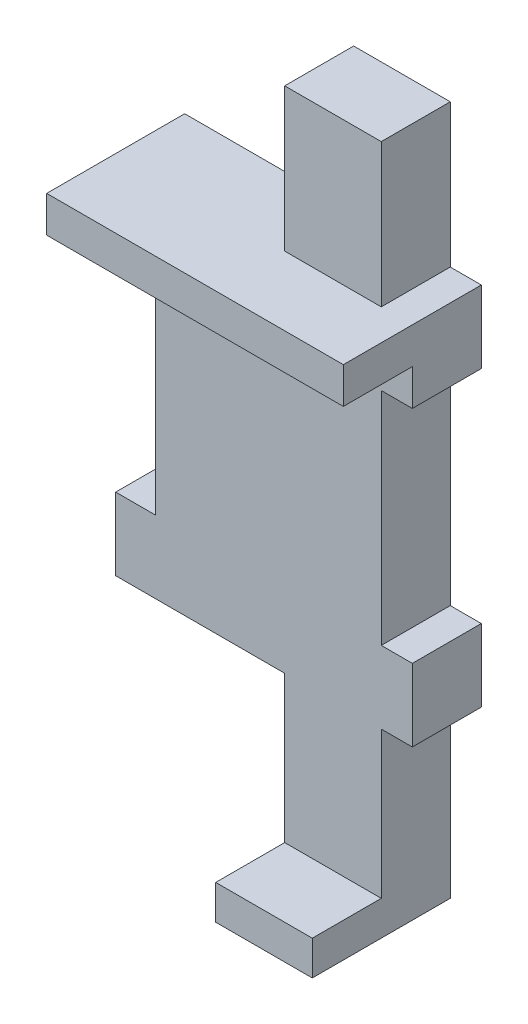
ISO-10303-21;
HEADER;
FILE_DESCRIPTION(('STEP AP214'),'2;1');
FILE_NAME('part.step','',(''),(''),'','','');
FILE_SCHEMA(('AUTOMOTIVE_DESIGN { 1 0 10303 214 1 1 1 1 }'));
ENDSEC;
DATA;
#1=APPLICATION_CONTEXT('core data for automotive mechanical design processes');
#2=APPLICATION_PROTOCOL_DEFINITION('international standard','automotive_design',2000,#1);
#3=PRODUCT_CONTEXT('',#1,'mechanical');
#4=PRODUCT('Part','Part','',(#3));
#5=PRODUCT_RELATED_PRODUCT_CATEGORY('part','',(#4));
#6=PRODUCT_DEFINITION_FORMATION('','',#4);
#7=PRODUCT_DEFINITION_CONTEXT('part definition',#1,'design');
#8=PRODUCT_DEFINITION('design','',#6,#7);
#9=PRODUCT_DEFINITION_SHAPE('','',#8);
#10=(LENGTH_UNIT() NAMED_UNIT(*) SI_UNIT(.MILLI.,.METRE.));
#11=(NAMED_UNIT(*) PLANE_ANGLE_UNIT() SI_UNIT($,.RADIAN.));
#12=(NAMED_UNIT(*) SI_UNIT($,.STERADIAN.) SOLID_ANGLE_UNIT());
#13=UNCERTAINTY_MEASURE_WITH_UNIT(LENGTH_MEASURE(1.E-05),#10,'distance_accuracy_value','');
#14=(GEOMETRIC_REPRESENTATION_CONTEXT(3) GLOBAL_UNCERTAINTY_ASSIGNED_CONTEXT((#13)) GLOBAL_UNIT_ASSIGNED_CONTEXT((#10,
#11,#12)) REPRESENTATION_CONTEXT('',''));
#15=CARTESIAN_POINT('',(0.,0.,0.));
#16=DIRECTION('',(0.,0.,1.));
#17=DIRECTION('',(1.,0.,0.));
#18=AXIS2_PLACEMENT_3D('',#15,#16,#17);
#19=CARTESIAN_POINT('',(0.,0.,4.));
#20=DIRECTION('',(0.,0.,1.));
#21=DIRECTION('',(1.,0.,0.));
#22=AXIS2_PLACEMENT_3D('',#19,#20,#21);
#23=PLANE('',#22);
#24=DIRECTION('',(0.,1.,0.));
#25=VECTOR('',#24,1.);
#26=CARTESIAN_POINT('',(4.6,11.7,4.));
#27=LINE('',#26,#25);
#28=CARTESIAN_POINT('',(4.6,7.5,4.));
#29=VERTEX_POINT('',#28);
#30=CARTESIAN_POINT('',(4.6,9.6,4.));
#31=VERTEX_POINT('',#30);
#32=EDGE_CURVE('E352',#29,#31,#27,.T.);
#33=ORIENTED_EDGE('',*,*,#32,.T.);
#34=DIRECTION('',(1.,0.,0.));
#35=VECTOR('',#34,1.);
#36=CARTESIAN_POINT('',(-12.6,9.6,4.));
#37=LINE('',#36,#35);
#38=CARTESIAN_POINT('',(-12.6,9.6,4.));
#39=VERTEX_POINT('',#38);
#40=EDGE_CURVE('E234',#39,#31,#37,.T.);
#41=ORIENTED_EDGE('',*,*,#40,.F.);
#42=DIRECTION('',(0.,1.,0.));
#43=VECTOR('',#42,1.);
#44=CARTESIAN_POINT('',(-12.6,11.7,4.));
#45=LINE('',#44,#43);
#46=CARTESIAN_POINT('',(-12.6,7.5,4.));
#47=VERTEX_POINT('',#46);
#48=EDGE_CURVE('E274',#47,#39,#45,.T.);
#49=ORIENTED_EDGE('',*,*,#48,.F.);
#50=DIRECTION('',(1.,0.,0.));
#51=VECTOR('',#50,1.);
#52=CARTESIAN_POINT('',(-4.6,7.5,4.));
#53=LINE('',#52,#51);
#54=CARTESIAN_POINT('',(-10.3,7.5,4.));
#55=VERTEX_POINT('',#54);
#56=EDGE_CURVE('E230',#47,#55,#53,.T.);
#57=ORIENTED_EDGE('',*,*,#56,.T.);
#58=DIRECTION('',(0.,1.,0.));
#59=VECTOR('',#58,1.);
#60=CARTESIAN_POINT('',(-10.3,7.5,4.));
#61=LINE('',#60,#59);
#62=CARTESIAN_POINT('',(-10.3,-5.3,4.));
#63=VERTEX_POINT('',#62);
#64=EDGE_CURVE('E223',#63,#55,#61,.T.);
#65=ORIENTED_EDGE('',*,*,#64,.F.);
#66=DIRECTION('',(1.,0.,0.));
#67=VECTOR('',#66,1.);
#68=CARTESIAN_POINT('',(-4.6,-5.3,4.));
#69=LINE('',#68,#67);
#70=CARTESIAN_POINT('',(-12.6,-5.3,4.));
#71=VERTEX_POINT('',#70);
#72=EDGE_CURVE('E204',#71,#63,#69,.T.);
#73=ORIENTED_EDGE('',*,*,#72,.F.);
#74=DIRECTION('',(0.,1.,0.));
#75=VECTOR('',#74,1.);
#76=CARTESIAN_POINT('',(-12.6,-5.3,4.));
#77=LINE('',#76,#75);
#78=CARTESIAN_POINT('',(-12.6,-9.5,4.));
#79=VERTEX_POINT('',#78);
#80=EDGE_CURVE('E285',#79,#71,#77,.T.);
#81=ORIENTED_EDGE('',*,*,#80,.F.);
#82=DIRECTION('',(1.,0.,0.));
#83=VECTOR('',#82,1.);
#84=CARTESIAN_POINT('',(-4.6,-9.5,4.));
#85=LINE('',#84,#83);
#86=CARTESIAN_POINT('',(-2.8,-9.5,4.));
#87=VERTEX_POINT('',#86);
#88=EDGE_CURVE('E216',#79,#87,#85,.T.);
#89=ORIENTED_EDGE('',*,*,#88,.T.);
#90=DIRECTION('',(0.,1.,0.));
#91=VECTOR('',#90,1.);
#92=CARTESIAN_POINT('',(-2.8,-20.,4.));
#93=LINE('',#92,#91);
#94=CARTESIAN_POINT('',(-2.8,-18.,4.));
#95=VERTEX_POINT('',#94);
#96=EDGE_CURVE('E426',#95,#87,#93,.T.);
#97=ORIENTED_EDGE('',*,*,#96,.F.);
#98=DIRECTION('',(-1.,0.,0.));
#99=VECTOR('',#98,1.);
#100=CARTESIAN_POINT('',(-2.8,-18.,4.));
#101=LINE('',#100,#99);
#102=CARTESIAN_POINT('',(2.8,-18.,4.));
#103=VERTEX_POINT('',#102);
#104=EDGE_CURVE('E388',#103,#95,#101,.T.);
#105=ORIENTED_EDGE('',*,*,#104,.F.);
#106=DIRECTION('',(0.,1.,0.));
#107=VECTOR('',#106,1.);
#108=CARTESIAN_POINT('',(2.8,-20.,4.));
#109=LINE('',#108,#107);
#110=CARTESIAN_POINT('',(2.8,-9.5,4.));
#111=VERTEX_POINT('',#110);
#112=EDGE_CURVE('E415',#103,#111,#109,.T.);
#113=ORIENTED_EDGE('',*,*,#112,.T.);
#114=DIRECTION('',(-1.,0.,0.));
#115=VECTOR('',#114,1.);
#116=CARTESIAN_POINT('',(4.6,-9.5,4.));
#117=LINE('',#116,#115);
#118=CARTESIAN_POINT('',(4.6,-9.5,4.));
#119=VERTEX_POINT('',#118);
#120=EDGE_CURVE('E319',#119,#111,#117,.T.);
#121=ORIENTED_EDGE('',*,*,#120,.F.);
#122=DIRECTION('',(0.,-1.,0.));
#123=VECTOR('',#122,1.);
#124=CARTESIAN_POINT('',(4.6,-9.5,4.));
#125=LINE('',#124,#123);
#126=CARTESIAN_POINT('',(4.6,-5.3,4.));
#127=VERTEX_POINT('',#126);
#128=EDGE_CURVE('E303',#127,#119,#125,.T.);
#129=ORIENTED_EDGE('',*,*,#128,.F.);
#130=DIRECTION('',(-1.,0.,0.));
#131=VECTOR('',#130,1.);
#132=CARTESIAN_POINT('',(4.6,-5.3,4.));
#133=LINE('',#132,#131);
#134=CARTESIAN_POINT('',(2.8,-5.3,4.));
#135=VERTEX_POINT('',#134);
#136=EDGE_CURVE('E323',#127,#135,#133,.T.);
#137=ORIENTED_EDGE('',*,*,#136,.T.);
#138=CARTESIAN_POINT('',(2.8,7.5,4.));
#139=VERTEX_POINT('',#138);
#140=EDGE_CURVE('E420',#135,#139,#109,.T.);
#141=ORIENTED_EDGE('',*,*,#140,.T.);
#142=DIRECTION('',(-1.,0.,0.));
#143=VECTOR('',#142,1.);
#144=CARTESIAN_POINT('',(4.6,7.5,4.));
#145=LINE('',#144,#143);
#146=EDGE_CURVE('E369',#29,#139,#145,.T.);
#147=ORIENTED_EDGE('',*,*,#146,.F.);
#148=EDGE_LOOP('',(#33,#41,#49,#57,#65,#73,#81,#89,#97,#105,#113,#121,#129,#137,#141,#147));
#149=FACE_BOUND('',#148,.T.);
#150=ADVANCED_FACE('F45',(#149),#23,.T.);
#151=CARTESIAN_POINT('',(-2.8,11.7,4.));
#152=VERTEX_POINT('',#151);
#153=CARTESIAN_POINT('',(-2.8,20.,4.));
#154=VERTEX_POINT('',#153);
#155=EDGE_CURVE('E425',#152,#154,#93,.T.);
#156=ORIENTED_EDGE('',*,*,#155,.F.);
#157=DIRECTION('',(-1.,0.,0.));
#158=VECTOR('',#157,1.);
#159=CARTESIAN_POINT('',(-12.6,11.7,4.));
#160=LINE('',#159,#158);
#161=CARTESIAN_POINT('',(2.8,11.7,4.));
#162=VERTEX_POINT('',#161);
#163=EDGE_CURVE('E243',#162,#152,#160,.T.);
#164=ORIENTED_EDGE('',*,*,#163,.F.);
#165=CARTESIAN_POINT('',(2.8,20.,4.));
#166=VERTEX_POINT('',#165);
#167=EDGE_CURVE('E421',#162,#166,#109,.T.);
#168=ORIENTED_EDGE('',*,*,#167,.T.);
#169=DIRECTION('',(1.,0.,0.));
#170=VECTOR('',#169,1.);
#171=CARTESIAN_POINT('',(-2.8,20.,4.));
#172=LINE('',#171,#170);
#173=EDGE_CURVE('E419',#154,#166,#172,.T.);
#174=ORIENTED_EDGE('',*,*,#173,.F.);
#175=EDGE_LOOP('',(#156,#164,#168,#174));
#176=FACE_BOUND('',#175,.T.);
#177=ADVANCED_FACE('F474',(#176),#23,.T.);
#178=CARTESIAN_POINT('',(2.8,-20.,4.));
#179=DIRECTION('',(-1.,0.,0.));
#180=DIRECTION('',(0.,0.,1.));
#181=AXIS2_PLACEMENT_3D('',#178,#179,#180);
#182=PLANE('',#181);
#183=DIRECTION('',(0.,0.,1.));
#184=VECTOR('',#183,1.);
#185=CARTESIAN_POINT('',(2.8,-5.3,0.));
#186=LINE('',#185,#184);
#187=CARTESIAN_POINT('',(2.8,-5.3,0.));
#188=VERTEX_POINT('',#187);
#189=EDGE_CURVE('E282',#188,#135,#186,.T.);
#190=ORIENTED_EDGE('',*,*,#189,.F.);
#191=DIRECTION('',(0.,1.,0.));
#192=VECTOR('',#191,1.);
#193=CARTESIAN_POINT('',(2.8,-20.,0.));
#194=LINE('',#193,#192);
#195=CARTESIAN_POINT('',(2.8,7.5,0.));
#196=VERTEX_POINT('',#195);
#197=EDGE_CURVE('E439',#188,#196,#194,.T.);
#198=ORIENTED_EDGE('',*,*,#197,.T.);
#199=DIRECTION('',(0.,0.,1.));
#200=VECTOR('',#199,1.);
#201=CARTESIAN_POINT('',(2.8,7.5,0.));
#202=LINE('',#201,#200);
#203=EDGE_CURVE('E348',#196,#139,#202,.T.);
#204=ORIENTED_EDGE('',*,*,#203,.T.);
#205=ORIENTED_EDGE('',*,*,#140,.F.);
#206=EDGE_LOOP('',(#190,#198,#204,#205));
#207=FACE_BOUND('',#206,.T.);
#208=ADVANCED_FACE('F487',(#207),#182,.F.);
#209=DIRECTION('',(0.,0.,-1.));
#210=VECTOR('',#209,1.);
#211=CARTESIAN_POINT('',(2.8,-9.5,0.));
#212=LINE('',#211,#210);
#213=CARTESIAN_POINT('',(2.8,-9.5,0.));
#214=VERTEX_POINT('',#213);
#215=EDGE_CURVE('E300',#111,#214,#212,.T.);
#216=ORIENTED_EDGE('',*,*,#215,.F.);
#217=ORIENTED_EDGE('',*,*,#112,.F.);
#218=DIRECTION('',(0.,0.,-1.));
#219=VECTOR('',#218,1.);
#220=CARTESIAN_POINT('',(2.8,-18.,8.));
#221=LINE('',#220,#219);
#222=CARTESIAN_POINT('',(2.8,-18.,8.));
#223=VERTEX_POINT('',#222);
#224=EDGE_CURVE('E410',#223,#103,#221,.T.);
#225=ORIENTED_EDGE('',*,*,#224,.F.);
#226=DIRECTION('',(0.,1.,0.));
#227=VECTOR('',#226,1.);
#228=CARTESIAN_POINT('',(2.8,-20.,8.));
#229=LINE('',#228,#227);
#230=CARTESIAN_POINT('',(2.8,-20.,8.));
#231=VERTEX_POINT('',#230);
#232=EDGE_CURVE('E397',#231,#223,#229,.T.);
#233=ORIENTED_EDGE('',*,*,#232,.F.);
#234=DIRECTION('',(0.,0.,-1.));
#235=VECTOR('',#234,1.);
#236=CARTESIAN_POINT('',(2.8,-20.,4.));
#237=LINE('',#236,#235);
#238=CARTESIAN_POINT('',(2.8,-20.,0.));
#239=VERTEX_POINT('',#238);
#240=EDGE_CURVE('E11',#231,#239,#237,.T.);
#241=ORIENTED_EDGE('',*,*,#240,.T.);
#242=EDGE_CURVE('E435',#239,#214,#194,.T.);
#243=ORIENTED_EDGE('',*,*,#242,.T.);
#244=EDGE_LOOP('',(#216,#217,#225,#233,#241,#243));
#245=FACE_BOUND('',#244,.T.);
#246=ADVANCED_FACE('F530',(#245),#182,.F.);
#247=CARTESIAN_POINT('',(-2.8,-20.,4.));
#248=DIRECTION('',(-1.,0.,0.));
#249=DIRECTION('',(0.,0.,1.));
#250=AXIS2_PLACEMENT_3D('',#247,#248,#249);
#251=PLANE('',#250);
#252=DIRECTION('',(0.,0.,-1.));
#253=VECTOR('',#252,1.);
#254=CARTESIAN_POINT('',(-2.8,-9.5,0.));
#255=LINE('',#254,#253);
#256=CARTESIAN_POINT('',(-2.8,-9.5,0.));
#257=VERTEX_POINT('',#256);
#258=EDGE_CURVE('E331',#87,#257,#255,.T.);
#259=ORIENTED_EDGE('',*,*,#258,.T.);
#260=DIRECTION('',(0.,1.,0.));
#261=VECTOR('',#260,1.);
#262=CARTESIAN_POINT('',(-2.8,-20.,0.));
#263=LINE('',#262,#261);
#264=CARTESIAN_POINT('',(-2.8,-20.,0.));
#265=VERTEX_POINT('',#264);
#266=EDGE_CURVE('E444',#265,#257,#263,.T.);
#267=ORIENTED_EDGE('',*,*,#266,.F.);
#268=DIRECTION('',(0.,0.,-1.));
#269=VECTOR('',#268,1.);
#270=CARTESIAN_POINT('',(-2.8,-20.,4.));
#271=LINE('',#270,#269);
#272=CARTESIAN_POINT('',(-2.8,-20.,8.));
#273=VERTEX_POINT('',#272);
#274=EDGE_CURVE('E430',#273,#265,#271,.T.);
#275=ORIENTED_EDGE('',*,*,#274,.F.);
#276=DIRECTION('',(0.,-1.,0.));
#277=VECTOR('',#276,1.);
#278=CARTESIAN_POINT('',(-2.8,-20.,8.));
#279=LINE('',#278,#277);
#280=CARTESIAN_POINT('',(-2.8,-18.,8.));
#281=VERTEX_POINT('',#280);
#282=EDGE_CURVE('E389',#281,#273,#279,.T.);
#283=ORIENTED_EDGE('',*,*,#282,.F.);
#284=DIRECTION('',(0.,0.,-1.));
#285=VECTOR('',#284,1.);
#286=CARTESIAN_POINT('',(-2.8,-18.,8.));
#287=LINE('',#286,#285);
#288=EDGE_CURVE('E403',#281,#95,#287,.T.);
#289=ORIENTED_EDGE('',*,*,#288,.T.);
#290=ORIENTED_EDGE('',*,*,#96,.T.);
#291=EDGE_LOOP('',(#259,#267,#275,#283,#289,#290));
#292=FACE_BOUND('',#291,.T.);
#293=ADVANCED_FACE('F527',(#292),#251,.T.);
#294=DIRECTION('',(0.,0.,-1.));
#295=VECTOR('',#294,1.);
#296=CARTESIAN_POINT('',(-2.8,11.7,0.));
#297=LINE('',#296,#295);
#298=CARTESIAN_POINT('',(-2.8,11.7,0.));
#299=VERTEX_POINT('',#298);
#300=EDGE_CURVE('E376',#152,#299,#297,.T.);
#301=ORIENTED_EDGE('',*,*,#300,.F.);
#302=ORIENTED_EDGE('',*,*,#155,.T.);
#303=DIRECTION('',(0.,0.,-1.));
#304=VECTOR('',#303,1.);
#305=CARTESIAN_POINT('',(-2.8,20.,4.));
#306=LINE('',#305,#304);
#307=CARTESIAN_POINT('',(-2.8,20.,0.));
#308=VERTEX_POINT('',#307);
#309=EDGE_CURVE('E450',#154,#308,#306,.T.);
#310=ORIENTED_EDGE('',*,*,#309,.T.);
#311=EDGE_CURVE('E443',#299,#308,#263,.T.);
#312=ORIENTED_EDGE('',*,*,#311,.F.);
#313=EDGE_LOOP('',(#301,#302,#310,#312));
#314=FACE_BOUND('',#313,.T.);
#315=ADVANCED_FACE('F471',(#314),#251,.T.);
#316=CARTESIAN_POINT('',(-2.8,-20.,4.));
#317=DIRECTION('',(0.,1.,0.));
#318=DIRECTION('',(0.,0.,1.));
#319=AXIS2_PLACEMENT_3D('',#316,#317,#318);
#320=PLANE('',#319);
#321=DIRECTION('',(1.,0.,0.));
#322=VECTOR('',#321,1.);
#323=CARTESIAN_POINT('',(-2.8,-20.,0.));
#324=LINE('',#323,#322);
#325=EDGE_CURVE('E414',#265,#239,#324,.T.);
#326=ORIENTED_EDGE('',*,*,#325,.T.);
#327=ORIENTED_EDGE('',*,*,#240,.F.);
#328=DIRECTION('',(1.,0.,0.));
#329=VECTOR('',#328,1.);
#330=CARTESIAN_POINT('',(-2.8,-20.,8.));
#331=LINE('',#330,#329);
#332=EDGE_CURVE('E393',#273,#231,#331,.T.);
#333=ORIENTED_EDGE('',*,*,#332,.F.);
#334=ORIENTED_EDGE('',*,*,#274,.T.);
#335=EDGE_LOOP('',(#326,#327,#333,#334));
#336=FACE_BOUND('',#335,.T.);
#337=ADVANCED_FACE('F47',(#336),#320,.F.);
#338=ORIENTED_EDGE('',*,*,#167,.F.);
#339=DIRECTION('',(0.,0.,-1.));
#340=VECTOR('',#339,1.);
#341=CARTESIAN_POINT('',(2.8,11.7,0.));
#342=LINE('',#341,#340);
#343=CARTESIAN_POINT('',(2.8,11.7,0.));
#344=VERTEX_POINT('',#343);
#345=EDGE_CURVE('E342',#162,#344,#342,.T.);
#346=ORIENTED_EDGE('',*,*,#345,.T.);
#347=CARTESIAN_POINT('',(2.8,20.,0.));
#348=VERTEX_POINT('',#347);
#349=EDGE_CURVE('E434',#344,#348,#194,.T.);
#350=ORIENTED_EDGE('',*,*,#349,.T.);
#351=DIRECTION('',(0.,0.,-1.));
#352=VECTOR('',#351,1.);
#353=CARTESIAN_POINT('',(2.8,20.,4.));
#354=LINE('',#353,#352);
#355=EDGE_CURVE('E54',#166,#348,#354,.T.);
#356=ORIENTED_EDGE('',*,*,#355,.F.);
#357=EDGE_LOOP('',(#338,#346,#350,#356));
#358=FACE_BOUND('',#357,.T.);
#359=ADVANCED_FACE('F533',(#358),#182,.F.);
#360=CARTESIAN_POINT('',(-2.8,20.,4.));
#361=DIRECTION('',(0.,1.,0.));
#362=DIRECTION('',(0.,0.,1.));
#363=AXIS2_PLACEMENT_3D('',#360,#361,#362);
#364=PLANE('',#363);
#365=DIRECTION('',(1.,0.,0.));
#366=VECTOR('',#365,1.);
#367=CARTESIAN_POINT('',(-2.8,20.,0.));
#368=LINE('',#367,#366);
#369=EDGE_CURVE('E438',#308,#348,#368,.T.);
#370=ORIENTED_EDGE('',*,*,#369,.F.);
#371=ORIENTED_EDGE('',*,*,#309,.F.);
#372=ORIENTED_EDGE('',*,*,#173,.T.);
#373=ORIENTED_EDGE('',*,*,#355,.T.);
#374=EDGE_LOOP('',(#370,#371,#372,#373));
#375=FACE_BOUND('',#374,.T.);
#376=ADVANCED_FACE('F458',(#375),#364,.T.);
#377=CARTESIAN_POINT('',(0.,0.,0.));
#378=DIRECTION('',(0.,0.,1.));
#379=DIRECTION('',(1.,0.,0.));
#380=AXIS2_PLACEMENT_3D('',#377,#378,#379);
#381=PLANE('',#380);
#382=CARTESIAN_POINT('',(-4.9,1.1,0.));
#383=DIRECTION('',(0.,0.,-1.));
#384=DIRECTION('',(-1.,0.,0.));
#385=AXIS2_PLACEMENT_3D('',#382,#383,#384);
#386=CIRCLE('',#385,1.5);
#387=CARTESIAN_POINT('',(-6.4,1.1,0.));
#388=VERTEX_POINT('',#387);
#389=EDGE_CURVE('E838',#388,#388,#386,.T.);
#390=ORIENTED_EDGE('',*,*,#389,.F.);
#391=EDGE_LOOP('',(#390));
#392=FACE_BOUND('',#391,.T.);
#393=ORIENTED_EDGE('',*,*,#325,.F.);
#394=ORIENTED_EDGE('',*,*,#266,.T.);
#395=DIRECTION('',(1.,0.,0.));
#396=VECTOR('',#395,1.);
#397=CARTESIAN_POINT('',(-4.6,-9.5,0.));
#398=LINE('',#397,#396);
#399=CARTESIAN_POINT('',(-12.6,-9.5,0.));
#400=VERTEX_POINT('',#399);
#401=EDGE_CURVE('E339',#400,#257,#398,.T.);
#402=ORIENTED_EDGE('',*,*,#401,.F.);
#403=DIRECTION('',(0.,-1.,0.));
#404=VECTOR('',#403,1.);
#405=CARTESIAN_POINT('',(-12.6,-5.3,0.));
#406=LINE('',#405,#404);
#407=CARTESIAN_POINT('',(-12.6,-5.3,0.));
#408=VERTEX_POINT('',#407);
#409=EDGE_CURVE('E270',#408,#400,#406,.T.);
#410=ORIENTED_EDGE('',*,*,#409,.F.);
#411=DIRECTION('',(1.,0.,0.));
#412=VECTOR('',#411,1.);
#413=CARTESIAN_POINT('',(-4.6,-5.3,0.));
#414=LINE('',#413,#412);
#415=CARTESIAN_POINT('',(-10.3,-5.3,0.));
#416=VERTEX_POINT('',#415);
#417=EDGE_CURVE('E217',#408,#416,#414,.T.);
#418=ORIENTED_EDGE('',*,*,#417,.T.);
#419=DIRECTION('',(0.,-1.,0.));
#420=VECTOR('',#419,1.);
#421=CARTESIAN_POINT('',(-10.3,7.5,0.));
#422=LINE('',#421,#420);
#423=CARTESIAN_POINT('',(-10.3,7.5,0.));
#424=VERTEX_POINT('',#423);
#425=EDGE_CURVE('E225',#424,#416,#422,.T.);
#426=ORIENTED_EDGE('',*,*,#425,.F.);
#427=DIRECTION('',(1.,0.,0.));
#428=VECTOR('',#427,1.);
#429=CARTESIAN_POINT('',(-4.6,7.5,0.));
#430=LINE('',#429,#428);
#431=CARTESIAN_POINT('',(-12.6,7.5,0.));
#432=VERTEX_POINT('',#431);
#433=EDGE_CURVE('E61',#432,#424,#430,.T.);
#434=ORIENTED_EDGE('',*,*,#433,.F.);
#435=DIRECTION('',(0.,-1.,0.));
#436=VECTOR('',#435,1.);
#437=CARTESIAN_POINT('',(-12.6,11.7,0.));
#438=LINE('',#437,#436);
#439=CARTESIAN_POINT('',(-12.6,11.7,0.));
#440=VERTEX_POINT('',#439);
#441=EDGE_CURVE('E265',#440,#432,#438,.T.);
#442=ORIENTED_EDGE('',*,*,#441,.F.);
#443=DIRECTION('',(1.,0.,0.));
#444=VECTOR('',#443,1.);
#445=CARTESIAN_POINT('',(-4.6,11.7,0.));
#446=LINE('',#445,#444);
#447=EDGE_CURVE('E380',#440,#299,#446,.T.);
#448=ORIENTED_EDGE('',*,*,#447,.T.);
#449=ORIENTED_EDGE('',*,*,#311,.T.);
#450=ORIENTED_EDGE('',*,*,#369,.T.);
#451=ORIENTED_EDGE('',*,*,#349,.F.);
#452=DIRECTION('',(-1.,0.,0.));
#453=VECTOR('',#452,1.);
#454=CARTESIAN_POINT('',(4.6,11.7,0.));
#455=LINE('',#454,#453);
#456=CARTESIAN_POINT('',(4.6,11.7,0.));
#457=VERTEX_POINT('',#456);
#458=EDGE_CURVE('E373',#457,#344,#455,.T.);
#459=ORIENTED_EDGE('',*,*,#458,.F.);
#460=DIRECTION('',(0.,-1.,0.));
#461=VECTOR('',#460,1.);
#462=CARTESIAN_POINT('',(4.6,11.7,0.));
#463=LINE('',#462,#461);
#464=CARTESIAN_POINT('',(4.6,7.5,0.));
#465=VERTEX_POINT('',#464);
#466=EDGE_CURVE('E343',#457,#465,#463,.T.);
#467=ORIENTED_EDGE('',*,*,#466,.T.);
#468=DIRECTION('',(-1.,0.,0.));
#469=VECTOR('',#468,1.);
#470=CARTESIAN_POINT('',(4.6,7.5,0.));
#471=LINE('',#470,#469);
#472=EDGE_CURVE('E359',#465,#196,#471,.T.);
#473=ORIENTED_EDGE('',*,*,#472,.T.);
#474=ORIENTED_EDGE('',*,*,#197,.F.);
#475=DIRECTION('',(-1.,0.,0.));
#476=VECTOR('',#475,1.);
#477=CARTESIAN_POINT('',(4.6,-5.3,0.));
#478=LINE('',#477,#476);
#479=CARTESIAN_POINT('',(4.6,-5.3,0.));
#480=VERTEX_POINT('',#479);
#481=EDGE_CURVE('E327',#480,#188,#478,.T.);
#482=ORIENTED_EDGE('',*,*,#481,.F.);
#483=DIRECTION('',(0.,1.,0.));
#484=VECTOR('',#483,1.);
#485=CARTESIAN_POINT('',(4.6,-9.5,0.));
#486=LINE('',#485,#484);
#487=CARTESIAN_POINT('',(4.6,-9.5,0.));
#488=VERTEX_POINT('',#487);
#489=EDGE_CURVE('E295',#488,#480,#486,.T.);
#490=ORIENTED_EDGE('',*,*,#489,.F.);
#491=DIRECTION('',(-1.,0.,0.));
#492=VECTOR('',#491,1.);
#493=CARTESIAN_POINT('',(4.6,-9.5,0.));
#494=LINE('',#493,#492);
#495=EDGE_CURVE('E309',#488,#214,#494,.T.);
#496=ORIENTED_EDGE('',*,*,#495,.T.);
#497=ORIENTED_EDGE('',*,*,#242,.F.);
#498=EDGE_LOOP('',(#393,#394,#402,#410,#418,#426,#434,#442,#448,#449,#450,#451,#459,#467,#473,
#474,#482,#490,#496,#497));
#499=FACE_BOUND('',#498,.T.);
#500=ADVANCED_FACE('F466',(#392,#499),#381,.F.);
#501=CARTESIAN_POINT('',(-2.8,-18.,8.));
#502=DIRECTION('',(0.,-1.,0.));
#503=DIRECTION('',(0.,0.,-1.));
#504=AXIS2_PLACEMENT_3D('',#501,#502,#503);
#505=PLANE('',#504);
#506=ORIENTED_EDGE('',*,*,#104,.T.);
#507=ORIENTED_EDGE('',*,*,#288,.F.);
#508=DIRECTION('',(-1.,0.,0.));
#509=VECTOR('',#508,1.);
#510=CARTESIAN_POINT('',(-2.8,-18.,8.));
#511=LINE('',#510,#509);
#512=EDGE_CURVE('E400',#223,#281,#511,.T.);
#513=ORIENTED_EDGE('',*,*,#512,.F.);
#514=ORIENTED_EDGE('',*,*,#224,.T.);
#515=EDGE_LOOP('',(#506,#507,#513,#514));
#516=FACE_BOUND('',#515,.T.);
#517=ADVANCED_FACE('F514',(#516),#505,.F.);
#518=CARTESIAN_POINT('',(0.,0.,8.));
#519=DIRECTION('',(0.,0.,-1.));
#520=DIRECTION('',(-1.,0.,0.));
#521=AXIS2_PLACEMENT_3D('',#518,#519,#520);
#522=PLANE('',#521);
#523=ORIENTED_EDGE('',*,*,#282,.T.);
#524=ORIENTED_EDGE('',*,*,#332,.T.);
#525=ORIENTED_EDGE('',*,*,#232,.T.);
#526=ORIENTED_EDGE('',*,*,#512,.T.);
#527=EDGE_LOOP('',(#523,#524,#525,#526));
#528=FACE_BOUND('',#527,.T.);
#529=ADVANCED_FACE('F504',(#528),#522,.F.);
#530=CARTESIAN_POINT('',(-4.6,7.5,0.));
#531=DIRECTION('',(0.,1.,0.));
#532=DIRECTION('',(0.,0.,1.));
#533=AXIS2_PLACEMENT_3D('',#530,#531,#532);
#534=PLANE('',#533);
#535=ORIENTED_EDGE('',*,*,#433,.T.);
#536=DIRECTION('',(0.,0.,-1.));
#537=VECTOR('',#536,1.);
#538=CARTESIAN_POINT('',(-10.3,7.5,0.));
#539=LINE('',#538,#537);
#540=EDGE_CURVE('E65',#55,#424,#539,.T.);
#541=ORIENTED_EDGE('',*,*,#540,.F.);
#542=ORIENTED_EDGE('',*,*,#56,.F.);
#543=DIRECTION('',(0.,0.,1.));
#544=VECTOR('',#543,1.);
#545=CARTESIAN_POINT('',(-12.6,7.5,0.));
#546=LINE('',#545,#544);
#547=EDGE_CURVE('E269',#432,#47,#546,.T.);
#548=ORIENTED_EDGE('',*,*,#547,.F.);
#549=EDGE_LOOP('',(#535,#541,#542,#548));
#550=FACE_BOUND('',#549,.T.);
#551=ADVANCED_FACE('F501',(#550),#534,.F.);
#552=CARTESIAN_POINT('',(-4.6,11.7,0.));
#553=DIRECTION('',(0.,-1.,0.));
#554=DIRECTION('',(0.,0.,-1.));
#555=AXIS2_PLACEMENT_3D('',#552,#553,#554);
#556=PLANE('',#555);
#557=ORIENTED_EDGE('',*,*,#300,.T.);
#558=ORIENTED_EDGE('',*,*,#447,.F.);
#559=DIRECTION('',(0.,0.,-1.));
#560=VECTOR('',#559,1.);
#561=CARTESIAN_POINT('',(-12.6,11.7,0.));
#562=LINE('',#561,#560);
#563=CARTESIAN_POINT('',(-12.6,11.7,8.));
#564=VERTEX_POINT('',#563);
#565=EDGE_CURVE('E278',#564,#440,#562,.T.);
#566=ORIENTED_EDGE('',*,*,#565,.F.);
#567=DIRECTION('',(-1.,0.,0.));
#568=VECTOR('',#567,1.);
#569=CARTESIAN_POINT('',(-12.6,11.7,8.));
#570=LINE('',#569,#568);
#571=CARTESIAN_POINT('',(4.6,11.7,8.));
#572=VERTEX_POINT('',#571);
#573=EDGE_CURVE('E250',#572,#564,#570,.T.);
#574=ORIENTED_EDGE('',*,*,#573,.F.);
#575=DIRECTION('',(0.,0.,-1.));
#576=VECTOR('',#575,1.);
#577=CARTESIAN_POINT('',(4.6,11.7,0.));
#578=LINE('',#577,#576);
#579=EDGE_CURVE('E347',#572,#457,#578,.T.);
#580=ORIENTED_EDGE('',*,*,#579,.T.);
#581=ORIENTED_EDGE('',*,*,#458,.T.);
#582=ORIENTED_EDGE('',*,*,#345,.F.);
#583=ORIENTED_EDGE('',*,*,#163,.T.);
#584=EDGE_LOOP('',(#557,#558,#566,#574,#580,#581,#582,#583));
#585=FACE_BOUND('',#584,.T.);
#586=ADVANCED_FACE('F503',(#585),#556,.F.);
#587=CARTESIAN_POINT('',(4.6,7.5,0.));
#588=DIRECTION('',(0.,-1.,0.));
#589=DIRECTION('',(0.,0.,-1.));
#590=AXIS2_PLACEMENT_3D('',#587,#588,#589);
#591=PLANE('',#590);
#592=ORIENTED_EDGE('',*,*,#203,.F.);
#593=ORIENTED_EDGE('',*,*,#472,.F.);
#594=DIRECTION('',(0.,0.,1.));
#595=VECTOR('',#594,1.);
#596=CARTESIAN_POINT('',(4.6,7.5,0.));
#597=LINE('',#596,#595);
#598=EDGE_CURVE('E355',#465,#29,#597,.T.);
#599=ORIENTED_EDGE('',*,*,#598,.T.);
#600=ORIENTED_EDGE('',*,*,#146,.T.);
#601=EDGE_LOOP('',(#592,#593,#599,#600));
#602=FACE_BOUND('',#601,.T.);
#603=ADVANCED_FACE('F485',(#602),#591,.T.);
#604=CARTESIAN_POINT('',(4.6,0.,0.));
#605=DIRECTION('',(1.,0.,0.));
#606=DIRECTION('',(0.,0.,1.));
#607=AXIS2_PLACEMENT_3D('',#604,#605,#606);
#608=PLANE('',#607);
#609=ORIENTED_EDGE('',*,*,#466,.F.);
#610=ORIENTED_EDGE('',*,*,#579,.F.);
#611=DIRECTION('',(0.,1.,0.));
#612=VECTOR('',#611,1.);
#613=CARTESIAN_POINT('',(4.6,11.7,8.));
#614=LINE('',#613,#612);
#615=CARTESIAN_POINT('',(4.6,9.6,8.));
#616=VERTEX_POINT('',#615);
#617=EDGE_CURVE('E246',#616,#572,#614,.T.);
#618=ORIENTED_EDGE('',*,*,#617,.F.);
#619=DIRECTION('',(0.,0.,-1.));
#620=VECTOR('',#619,1.);
#621=CARTESIAN_POINT('',(4.6,9.6,8.));
#622=LINE('',#621,#620);
#623=EDGE_CURVE('E254',#616,#31,#622,.T.);
#624=ORIENTED_EDGE('',*,*,#623,.T.);
#625=ORIENTED_EDGE('',*,*,#32,.F.);
#626=ORIENTED_EDGE('',*,*,#598,.F.);
#627=EDGE_LOOP('',(#609,#610,#618,#624,#625,#626));
#628=FACE_BOUND('',#627,.T.);
#629=ADVANCED_FACE('F492',(#628),#608,.T.);
#630=CARTESIAN_POINT('',(-4.6,-9.5,0.));
#631=DIRECTION('',(0.,-1.,0.));
#632=DIRECTION('',(0.,0.,-1.));
#633=AXIS2_PLACEMENT_3D('',#630,#631,#632);
#634=PLANE('',#633);
#635=ORIENTED_EDGE('',*,*,#258,.F.);
#636=ORIENTED_EDGE('',*,*,#88,.F.);
#637=DIRECTION('',(0.,0.,1.));
#638=VECTOR('',#637,1.);
#639=CARTESIAN_POINT('',(-12.6,-9.5,0.));
#640=LINE('',#639,#638);
#641=EDGE_CURVE('E288',#400,#79,#640,.T.);
#642=ORIENTED_EDGE('',*,*,#641,.F.);
#643=ORIENTED_EDGE('',*,*,#401,.T.);
#644=EDGE_LOOP('',(#635,#636,#642,#643));
#645=FACE_BOUND('',#644,.T.);
#646=ADVANCED_FACE('F565',(#645),#634,.T.);
#647=CARTESIAN_POINT('',(-4.6,-5.3,0.));
#648=DIRECTION('',(0.,1.,0.));
#649=DIRECTION('',(0.,0.,1.));
#650=AXIS2_PLACEMENT_3D('',#647,#648,#649);
#651=PLANE('',#650);
#652=DIRECTION('',(0.,0.,1.));
#653=VECTOR('',#652,1.);
#654=CARTESIAN_POINT('',(-10.3,-5.3,0.));
#655=LINE('',#654,#653);
#656=EDGE_CURVE('E207',#416,#63,#655,.T.);
#657=ORIENTED_EDGE('',*,*,#656,.F.);
#658=ORIENTED_EDGE('',*,*,#417,.F.);
#659=DIRECTION('',(0.,0.,-1.));
#660=VECTOR('',#659,1.);
#661=CARTESIAN_POINT('',(-12.6,-5.3,0.));
#662=LINE('',#661,#660);
#663=EDGE_CURVE('E210',#71,#408,#662,.T.);
#664=ORIENTED_EDGE('',*,*,#663,.F.);
#665=ORIENTED_EDGE('',*,*,#72,.T.);
#666=EDGE_LOOP('',(#657,#658,#664,#665));
#667=FACE_BOUND('',#666,.T.);
#668=ADVANCED_FACE('F206',(#667),#651,.T.);
#669=CARTESIAN_POINT('',(4.6,-5.3,0.));
#670=DIRECTION('',(0.,-1.,0.));
#671=DIRECTION('',(0.,0.,-1.));
#672=AXIS2_PLACEMENT_3D('',#669,#670,#671);
#673=PLANE('',#672);
#674=ORIENTED_EDGE('',*,*,#189,.T.);
#675=ORIENTED_EDGE('',*,*,#136,.F.);
#676=DIRECTION('',(0.,0.,1.));
#677=VECTOR('',#676,1.);
#678=CARTESIAN_POINT('',(4.6,-5.3,0.));
#679=LINE('',#678,#677);
#680=EDGE_CURVE('E299',#480,#127,#679,.T.);
#681=ORIENTED_EDGE('',*,*,#680,.F.);
#682=ORIENTED_EDGE('',*,*,#481,.T.);
#683=EDGE_LOOP('',(#674,#675,#681,#682));
#684=FACE_BOUND('',#683,.T.);
#685=ADVANCED_FACE('F556',(#684),#673,.F.);
#686=CARTESIAN_POINT('',(4.6,-9.5,0.));
#687=DIRECTION('',(0.,1.,0.));
#688=DIRECTION('',(0.,0.,1.));
#689=AXIS2_PLACEMENT_3D('',#686,#687,#688);
#690=PLANE('',#689);
#691=ORIENTED_EDGE('',*,*,#215,.T.);
#692=ORIENTED_EDGE('',*,*,#495,.F.);
#693=DIRECTION('',(0.,0.,-1.));
#694=VECTOR('',#693,1.);
#695=CARTESIAN_POINT('',(4.6,-9.5,0.));
#696=LINE('',#695,#694);
#697=EDGE_CURVE('E306',#119,#488,#696,.T.);
#698=ORIENTED_EDGE('',*,*,#697,.F.);
#699=ORIENTED_EDGE('',*,*,#120,.T.);
#700=EDGE_LOOP('',(#691,#692,#698,#699));
#701=FACE_BOUND('',#700,.T.);
#702=ADVANCED_FACE('F551',(#701),#690,.F.);
#703=CARTESIAN_POINT('',(4.6,2.2,0.));
#704=DIRECTION('',(1.,0.,0.));
#705=DIRECTION('',(0.,0.,1.));
#706=AXIS2_PLACEMENT_3D('',#703,#704,#705);
#707=PLANE('',#706);
#708=ORIENTED_EDGE('',*,*,#489,.T.);
#709=ORIENTED_EDGE('',*,*,#680,.T.);
#710=ORIENTED_EDGE('',*,*,#128,.T.);
#711=ORIENTED_EDGE('',*,*,#697,.T.);
#712=EDGE_LOOP('',(#708,#709,#710,#711));
#713=FACE_BOUND('',#712,.T.);
#714=ADVANCED_FACE('F554',(#713),#707,.T.);
#715=CARTESIAN_POINT('',(-12.6,0.,0.));
#716=DIRECTION('',(-1.,0.,0.));
#717=DIRECTION('',(0.,0.,1.));
#718=AXIS2_PLACEMENT_3D('',#715,#716,#717);
#719=PLANE('',#718);
#720=ORIENTED_EDGE('',*,*,#409,.T.);
#721=ORIENTED_EDGE('',*,*,#641,.T.);
#722=ORIENTED_EDGE('',*,*,#80,.T.);
#723=ORIENTED_EDGE('',*,*,#663,.T.);
#724=EDGE_LOOP('',(#720,#721,#722,#723));
#725=FACE_BOUND('',#724,.T.);
#726=ADVANCED_FACE('F567',(#725),#719,.T.);
#727=CARTESIAN_POINT('',(-12.6,0.,0.));
#728=DIRECTION('',(-1.,0.,0.));
#729=DIRECTION('',(0.,0.,1.));
#730=AXIS2_PLACEMENT_3D('',#727,#728,#729);
#731=PLANE('',#730);
#732=ORIENTED_EDGE('',*,*,#441,.T.);
#733=ORIENTED_EDGE('',*,*,#547,.T.);
#734=ORIENTED_EDGE('',*,*,#48,.T.);
#735=DIRECTION('',(0.,0.,-1.));
#736=VECTOR('',#735,1.);
#737=CARTESIAN_POINT('',(-12.6,9.6,8.));
#738=LINE('',#737,#736);
#739=CARTESIAN_POINT('',(-12.6,9.6,8.));
#740=VERTEX_POINT('',#739);
#741=EDGE_CURVE('E262',#740,#39,#738,.T.);
#742=ORIENTED_EDGE('',*,*,#741,.F.);
#743=DIRECTION('',(0.,-1.,0.));
#744=VECTOR('',#743,1.);
#745=CARTESIAN_POINT('',(-12.6,11.7,8.));
#746=LINE('',#745,#744);
#747=EDGE_CURVE('E238',#564,#740,#746,.T.);
#748=ORIENTED_EDGE('',*,*,#747,.F.);
#749=ORIENTED_EDGE('',*,*,#565,.T.);
#750=EDGE_LOOP('',(#732,#733,#734,#742,#748,#749));
#751=FACE_BOUND('',#750,.T.);
#752=ADVANCED_FACE('F499',(#751),#731,.T.);
#753=CARTESIAN_POINT('',(-12.6,9.6,8.));
#754=DIRECTION('',(0.,1.,0.));
#755=DIRECTION('',(0.,0.,1.));
#756=AXIS2_PLACEMENT_3D('',#753,#754,#755);
#757=PLANE('',#756);
#758=ORIENTED_EDGE('',*,*,#40,.T.);
#759=ORIENTED_EDGE('',*,*,#623,.F.);
#760=DIRECTION('',(1.,0.,0.));
#761=VECTOR('',#760,1.);
#762=CARTESIAN_POINT('',(-12.6,9.6,8.));
#763=LINE('',#762,#761);
#764=EDGE_CURVE('E242',#740,#616,#763,.T.);
#765=ORIENTED_EDGE('',*,*,#764,.F.);
#766=ORIENTED_EDGE('',*,*,#741,.T.);
#767=EDGE_LOOP('',(#758,#759,#765,#766));
#768=FACE_BOUND('',#767,.T.);
#769=ADVANCED_FACE('F750',(#768),#757,.F.);
#770=CARTESIAN_POINT('',(0.,0.,8.));
#771=DIRECTION('',(0.,0.,1.));
#772=DIRECTION('',(1.,0.,0.));
#773=AXIS2_PLACEMENT_3D('',#770,#771,#772);
#774=PLANE('',#773);
#775=ORIENTED_EDGE('',*,*,#747,.T.);
#776=ORIENTED_EDGE('',*,*,#764,.T.);
#777=ORIENTED_EDGE('',*,*,#617,.T.);
#778=ORIENTED_EDGE('',*,*,#573,.T.);
#779=EDGE_LOOP('',(#775,#776,#777,#778));
#780=FACE_BOUND('',#779,.T.);
#781=ADVANCED_FACE('F717',(#780),#774,.T.);
#782=CARTESIAN_POINT('',(-10.3,0.,0.));
#783=DIRECTION('',(-1.,0.,0.));
#784=DIRECTION('',(0.,0.,1.));
#785=AXIS2_PLACEMENT_3D('',#782,#783,#784);
#786=PLANE('',#785);
#787=ORIENTED_EDGE('',*,*,#425,.T.);
#788=ORIENTED_EDGE('',*,*,#656,.T.);
#789=ORIENTED_EDGE('',*,*,#64,.T.);
#790=ORIENTED_EDGE('',*,*,#540,.T.);
#791=EDGE_LOOP('',(#787,#788,#789,#790));
#792=FACE_BOUND('',#791,.T.);
#793=ADVANCED_FACE('F222',(#792),#786,.T.);
#794=CARTESIAN_POINT('',(-4.9,1.1,1.));
#795=DIRECTION('',(0.,0.,-1.));
#796=DIRECTION('',(-1.,0.,0.));
#797=AXIS2_PLACEMENT_3D('',#794,#795,#796);
#798=CYLINDRICAL_SURFACE('',#797,1.5);
#799=CARTESIAN_POINT('',(-4.9,1.1,1.));
#800=DIRECTION('',(0.,0.,-1.));
#801=DIRECTION('',(-1.,0.,0.));
#802=AXIS2_PLACEMENT_3D('',#799,#800,#801);
#803=CIRCLE('',#802,1.5);
#804=CARTESIAN_POINT('',(-6.4,1.1,1.));
#805=VERTEX_POINT('',#804);
#806=EDGE_CURVE('E835',#805,#805,#803,.T.);
#807=ORIENTED_EDGE('',*,*,#806,.F.);
#808=EDGE_LOOP('',(#807));
#809=FACE_BOUND('',#808,.T.);
#810=ORIENTED_EDGE('',*,*,#389,.T.);
#811=EDGE_LOOP('',(#810));
#812=FACE_BOUND('',#811,.T.);
#813=ADVANCED_FACE('F716',(#809,#812),#798,.F.);
#814=CARTESIAN_POINT('',(-4.9,1.1,1.));
#815=DIRECTION('',(0.,0.,-1.));
#816=DIRECTION('',(-1.,0.,0.));
#817=AXIS2_PLACEMENT_3D('',#814,#815,#816);
#818=PLANE('',#817);
#819=ORIENTED_EDGE('',*,*,#806,.T.);
#820=EDGE_LOOP('',(#819));
#821=FACE_BOUND('',#820,.T.);
#822=ADVANCED_FACE('F730',(#821),#818,.T.);
#823=CLOSED_SHELL('',(#150,#177,#208,#246,#293,#315,#337,#359,#376,#500,#517,#529,#551,#586,
#603,#629,#646,#668,#685,#702,#714,#726,#752,#769,#781,#793,#813,#822));
#824=MANIFOLD_SOLID_BREP('B2',#823);
#825=ADVANCED_BREP_SHAPE_REPRESENTATION('',(#18,#824),#14);
#826=SHAPE_DEFINITION_REPRESENTATION(#9,#825);
ENDSEC;
END-ISO-10303-21;
